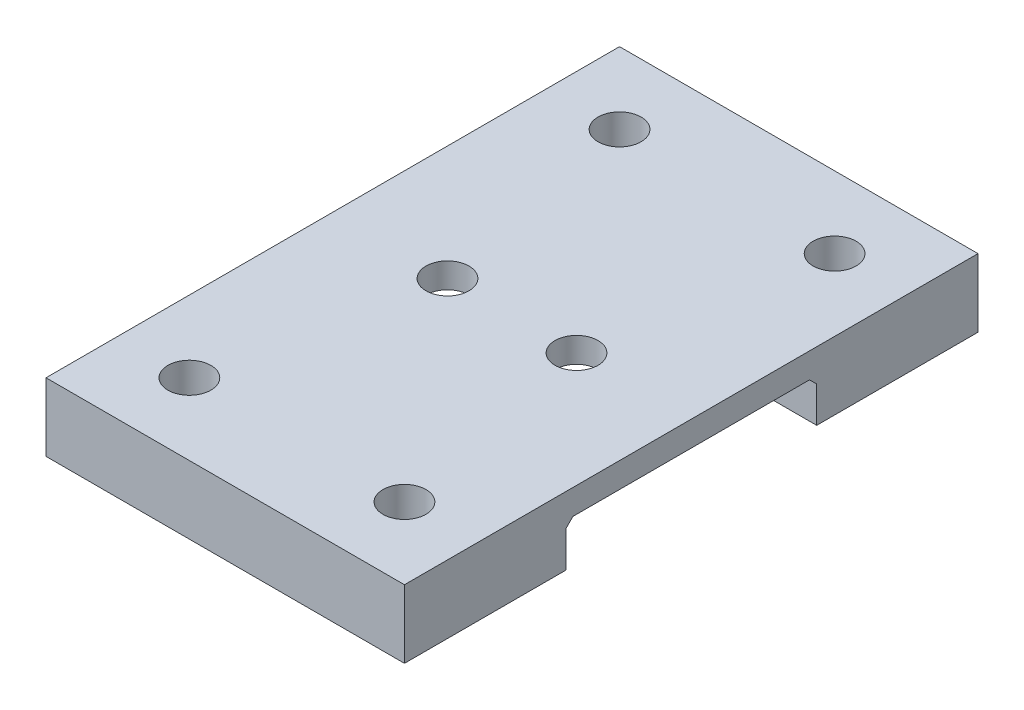
ISO-10303-21;
HEADER;
FILE_DESCRIPTION(('STEP AP214'),'2;1');
FILE_NAME('part.step','',(''),(''),'','','');
FILE_SCHEMA(('AUTOMOTIVE_DESIGN { 1 0 10303 214 1 1 1 1 }'));
ENDSEC;
DATA;
#1=APPLICATION_CONTEXT('core data for automotive mechanical design processes');
#2=APPLICATION_PROTOCOL_DEFINITION('international standard','automotive_design',2000,#1);
#3=PRODUCT_CONTEXT('',#1,'mechanical');
#4=PRODUCT('Part','Part','',(#3));
#5=PRODUCT_RELATED_PRODUCT_CATEGORY('part','',(#4));
#6=PRODUCT_DEFINITION_FORMATION('','',#4);
#7=PRODUCT_DEFINITION_CONTEXT('part definition',#1,'design');
#8=PRODUCT_DEFINITION('design','',#6,#7);
#9=PRODUCT_DEFINITION_SHAPE('','',#8);
#10=(LENGTH_UNIT() NAMED_UNIT(*) SI_UNIT(.MILLI.,.METRE.));
#11=(NAMED_UNIT(*) PLANE_ANGLE_UNIT() SI_UNIT($,.RADIAN.));
#12=(NAMED_UNIT(*) SI_UNIT($,.STERADIAN.) SOLID_ANGLE_UNIT());
#13=UNCERTAINTY_MEASURE_WITH_UNIT(LENGTH_MEASURE(1.E-05),#10,'distance_accuracy_value','');
#14=(GEOMETRIC_REPRESENTATION_CONTEXT(3) GLOBAL_UNCERTAINTY_ASSIGNED_CONTEXT((#13)) GLOBAL_UNIT_ASSIGNED_CONTEXT((#10,
#11,#12)) REPRESENTATION_CONTEXT('',''));
#15=CARTESIAN_POINT('',(0.,0.,0.));
#16=DIRECTION('',(0.,0.,1.));
#17=DIRECTION('',(1.,0.,0.));
#18=AXIS2_PLACEMENT_3D('',#15,#16,#17);
#19=CARTESIAN_POINT('',(0.,0.,0.));
#20=DIRECTION('',(0.,-1.,0.));
#21=DIRECTION('',(0.,0.,-1.));
#22=AXIS2_PLACEMENT_3D('',#19,#20,#21);
#23=PLANE('',#22);
#24=DIRECTION('',(1.,0.,0.));
#25=VECTOR('',#24,1.);
#26=CARTESIAN_POINT('',(-40.05051095991,0.,-17.5));
#27=LINE('',#26,#25);
#28=CARTESIAN_POINT('',(-25.,0.,-17.5));
#29=VERTEX_POINT('',#28);
#30=CARTESIAN_POINT('',(25.,0.,-17.5));
#31=VERTEX_POINT('',#30);
#32=EDGE_CURVE('E124',#29,#31,#27,.T.);
#33=ORIENTED_EDGE('',*,*,#32,.F.);
#34=DIRECTION('',(0.,0.,1.));
#35=VECTOR('',#34,1.);
#36=CARTESIAN_POINT('',(-25.,0.,40.));
#37=LINE('',#36,#35);
#38=CARTESIAN_POINT('',(-25.,0.,-40.));
#39=VERTEX_POINT('',#38);
#40=EDGE_CURVE('E141',#39,#29,#37,.T.);
#41=ORIENTED_EDGE('',*,*,#40,.F.);
#42=DIRECTION('',(-1.,0.,0.));
#43=VECTOR('',#42,1.);
#44=CARTESIAN_POINT('',(-25.,0.,-40.));
#45=LINE('',#44,#43);
#46=CARTESIAN_POINT('',(25.,0.,-40.));
#47=VERTEX_POINT('',#46);
#48=EDGE_CURVE('E132',#47,#39,#45,.T.);
#49=ORIENTED_EDGE('',*,*,#48,.F.);
#50=DIRECTION('',(0.,0.,-1.));
#51=VECTOR('',#50,1.);
#52=CARTESIAN_POINT('',(25.,0.,40.));
#53=LINE('',#52,#51);
#54=EDGE_CURVE('E133',#31,#47,#53,.T.);
#55=ORIENTED_EDGE('',*,*,#54,.F.);
#56=EDGE_LOOP('',(#33,#41,#49,#55));
#57=FACE_BOUND('',#56,.T.);
#58=CARTESIAN_POINT('',(15.,0.,-30.));
#59=DIRECTION('',(0.,1.,0.));
#60=DIRECTION('',(0.,0.,-1.));
#61=AXIS2_PLACEMENT_3D('',#58,#59,#60);
#62=CIRCLE('',#61,3.00000000000001);
#63=CARTESIAN_POINT('',(15.,0.,-33.));
#64=VERTEX_POINT('',#63);
#65=EDGE_CURVE('E207',#64,#64,#62,.T.);
#66=ORIENTED_EDGE('',*,*,#65,.T.);
#67=EDGE_LOOP('',(#66));
#68=FACE_BOUND('',#67,.T.);
#69=CARTESIAN_POINT('',(-15.,0.,-30.));
#70=DIRECTION('',(0.,1.,0.));
#71=DIRECTION('',(0.,0.,1.));
#72=AXIS2_PLACEMENT_3D('',#69,#70,#71);
#73=CIRCLE('',#72,3.);
#74=CARTESIAN_POINT('',(-15.,0.,-27.));
#75=VERTEX_POINT('',#74);
#76=EDGE_CURVE('E213',#75,#75,#73,.T.);
#77=ORIENTED_EDGE('',*,*,#76,.T.);
#78=EDGE_LOOP('',(#77));
#79=FACE_BOUND('',#78,.T.);
#80=ADVANCED_FACE('F33',(#57,#68,#79),#23,.T.);
#81=CARTESIAN_POINT('',(0.,9.5,0.));
#82=DIRECTION('',(0.,-1.,0.));
#83=DIRECTION('',(0.,0.,-1.));
#84=AXIS2_PLACEMENT_3D('',#81,#82,#83);
#85=PLANE('',#84);
#86=CARTESIAN_POINT('',(-9.,9.5,0.));
#87=DIRECTION('',(0.,-1.,0.));
#88=DIRECTION('',(0.,0.,-1.));
#89=AXIS2_PLACEMENT_3D('',#86,#87,#88);
#90=CIRCLE('',#89,3.0000000000005);
#91=CARTESIAN_POINT('',(-9.,9.5,-3.0000000000005));
#92=VERTEX_POINT('',#91);
#93=EDGE_CURVE('E125',#92,#92,#90,.T.);
#94=ORIENTED_EDGE('',*,*,#93,.T.);
#95=EDGE_LOOP('',(#94));
#96=FACE_BOUND('',#95,.T.);
#97=CARTESIAN_POINT('',(9.00000000000076,9.5,-3.85108611666851E-13));
#98=DIRECTION('',(0.,-1.,0.));
#99=DIRECTION('',(0.,0.,-1.));
#100=AXIS2_PLACEMENT_3D('',#97,#98,#99);
#101=CIRCLE('',#100,3.0000000000005);
#102=CARTESIAN_POINT('',(9.00000000000076,9.5,-3.00000000000088));
#103=VERTEX_POINT('',#102);
#104=EDGE_CURVE('E244',#103,#103,#101,.T.);
#105=ORIENTED_EDGE('',*,*,#104,.T.);
#106=EDGE_LOOP('',(#105));
#107=FACE_BOUND('',#106,.T.);
#108=DIRECTION('',(0.,0.,-1.));
#109=VECTOR('',#108,1.);
#110=CARTESIAN_POINT('',(25.,9.5,40.));
#111=LINE('',#110,#109);
#112=CARTESIAN_POINT('',(25.,9.5,40.));
#113=VERTEX_POINT('',#112);
#114=CARTESIAN_POINT('',(25.,9.5,-40.));
#115=VERTEX_POINT('',#114);
#116=EDGE_CURVE('E146',#113,#115,#111,.T.);
#117=ORIENTED_EDGE('',*,*,#116,.T.);
#118=DIRECTION('',(-1.,0.,0.));
#119=VECTOR('',#118,1.);
#120=CARTESIAN_POINT('',(-25.,9.5,-40.));
#121=LINE('',#120,#119);
#122=CARTESIAN_POINT('',(-25.,9.5,-40.));
#123=VERTEX_POINT('',#122);
#124=EDGE_CURVE('E222',#115,#123,#121,.T.);
#125=ORIENTED_EDGE('',*,*,#124,.T.);
#126=DIRECTION('',(0.,0.,1.));
#127=VECTOR('',#126,1.);
#128=CARTESIAN_POINT('',(-25.,9.5,40.));
#129=LINE('',#128,#127);
#130=CARTESIAN_POINT('',(-25.,9.5,40.));
#131=VERTEX_POINT('',#130);
#132=EDGE_CURVE('E223',#123,#131,#129,.T.);
#133=ORIENTED_EDGE('',*,*,#132,.T.);
#134=DIRECTION('',(1.,0.,0.));
#135=VECTOR('',#134,1.);
#136=CARTESIAN_POINT('',(-25.,9.5,40.));
#137=LINE('',#136,#135);
#138=EDGE_CURVE('E138',#131,#113,#137,.T.);
#139=ORIENTED_EDGE('',*,*,#138,.T.);
#140=EDGE_LOOP('',(#117,#125,#133,#139));
#141=FACE_BOUND('',#140,.T.);
#142=CARTESIAN_POINT('',(-15.,9.5,-30.));
#143=DIRECTION('',(0.,1.,0.));
#144=DIRECTION('',(0.,0.,1.));
#145=AXIS2_PLACEMENT_3D('',#142,#143,#144);
#146=CIRCLE('',#145,3.);
#147=CARTESIAN_POINT('',(-15.,9.5,-27.));
#148=VERTEX_POINT('',#147);
#149=EDGE_CURVE('E136',#148,#148,#146,.T.);
#150=ORIENTED_EDGE('',*,*,#149,.F.);
#151=EDGE_LOOP('',(#150));
#152=FACE_BOUND('',#151,.T.);
#153=CARTESIAN_POINT('',(15.,9.5,-30.));
#154=DIRECTION('',(0.,1.,0.));
#155=DIRECTION('',(0.,0.,-1.));
#156=AXIS2_PLACEMENT_3D('',#153,#154,#155);
#157=CIRCLE('',#156,3.00000000000001);
#158=CARTESIAN_POINT('',(15.,9.5,-33.));
#159=VERTEX_POINT('',#158);
#160=EDGE_CURVE('E210',#159,#159,#157,.T.);
#161=ORIENTED_EDGE('',*,*,#160,.F.);
#162=EDGE_LOOP('',(#161));
#163=FACE_BOUND('',#162,.T.);
#164=CARTESIAN_POINT('',(-15.,9.5,30.));
#165=DIRECTION('',(0.,1.,0.));
#166=DIRECTION('',(0.,0.,-1.));
#167=AXIS2_PLACEMENT_3D('',#164,#165,#166);
#168=CIRCLE('',#167,2.99999999999999);
#169=CARTESIAN_POINT('',(-15.,9.5,27.));
#170=VERTEX_POINT('',#169);
#171=EDGE_CURVE('E204',#170,#170,#168,.T.);
#172=ORIENTED_EDGE('',*,*,#171,.F.);
#173=EDGE_LOOP('',(#172));
#174=FACE_BOUND('',#173,.T.);
#175=CARTESIAN_POINT('',(15.,9.5,30.));
#176=DIRECTION('',(0.,1.,0.));
#177=DIRECTION('',(0.,0.,1.));
#178=AXIS2_PLACEMENT_3D('',#175,#176,#177);
#179=CIRCLE('',#178,3.);
#180=CARTESIAN_POINT('',(15.,9.5,33.));
#181=VERTEX_POINT('',#180);
#182=EDGE_CURVE('E197',#181,#181,#179,.T.);
#183=ORIENTED_EDGE('',*,*,#182,.F.);
#184=EDGE_LOOP('',(#183));
#185=FACE_BOUND('',#184,.T.);
#186=ADVANCED_FACE('F228',(#96,#107,#141,#152,#163,#174,#185),#85,.F.);
#187=DIRECTION('',(-1.,0.,0.));
#188=VECTOR('',#187,1.);
#189=CARTESIAN_POINT('',(-40.05051095991,0.,17.5));
#190=LINE('',#189,#188);
#191=CARTESIAN_POINT('',(25.,0.,17.5));
#192=VERTEX_POINT('',#191);
#193=CARTESIAN_POINT('',(-25.,0.,17.5));
#194=VERTEX_POINT('',#193);
#195=EDGE_CURVE('E109',#192,#194,#190,.T.);
#196=ORIENTED_EDGE('',*,*,#195,.F.);
#197=CARTESIAN_POINT('',(25.,0.,40.));
#198=VERTEX_POINT('',#197);
#199=EDGE_CURVE('E122',#198,#192,#53,.T.);
#200=ORIENTED_EDGE('',*,*,#199,.F.);
#201=DIRECTION('',(1.,0.,0.));
#202=VECTOR('',#201,1.);
#203=CARTESIAN_POINT('',(-25.,0.,40.));
#204=LINE('',#203,#202);
#205=CARTESIAN_POINT('',(-25.,0.,40.));
#206=VERTEX_POINT('',#205);
#207=EDGE_CURVE('E144',#206,#198,#204,.T.);
#208=ORIENTED_EDGE('',*,*,#207,.F.);
#209=EDGE_CURVE('E123',#194,#206,#37,.T.);
#210=ORIENTED_EDGE('',*,*,#209,.F.);
#211=EDGE_LOOP('',(#196,#200,#208,#210));
#212=FACE_BOUND('',#211,.T.);
#213=CARTESIAN_POINT('',(-15.,0.,30.));
#214=DIRECTION('',(0.,1.,0.));
#215=DIRECTION('',(0.,0.,-1.));
#216=AXIS2_PLACEMENT_3D('',#213,#214,#215);
#217=CIRCLE('',#216,2.99999999999999);
#218=CARTESIAN_POINT('',(-15.,0.,27.));
#219=VERTEX_POINT('',#218);
#220=EDGE_CURVE('E202',#219,#219,#217,.T.);
#221=ORIENTED_EDGE('',*,*,#220,.T.);
#222=EDGE_LOOP('',(#221));
#223=FACE_BOUND('',#222,.T.);
#224=CARTESIAN_POINT('',(15.,0.,30.));
#225=DIRECTION('',(0.,1.,0.));
#226=DIRECTION('',(0.,0.,1.));
#227=AXIS2_PLACEMENT_3D('',#224,#225,#226);
#228=CIRCLE('',#227,3.);
#229=CARTESIAN_POINT('',(15.,0.,33.));
#230=VERTEX_POINT('',#229);
#231=EDGE_CURVE('E194',#230,#230,#228,.T.);
#232=ORIENTED_EDGE('',*,*,#231,.T.);
#233=EDGE_LOOP('',(#232));
#234=FACE_BOUND('',#233,.T.);
#235=ADVANCED_FACE('F119',(#212,#223,#234),#23,.T.);
#236=CARTESIAN_POINT('',(25.,9.5,40.));
#237=DIRECTION('',(-1.,0.,0.));
#238=DIRECTION('',(0.,0.,1.));
#239=AXIS2_PLACEMENT_3D('',#236,#237,#238);
#240=PLANE('',#239);
#241=DIRECTION('',(0.,1.,0.));
#242=VECTOR('',#241,1.);
#243=CARTESIAN_POINT('',(25.,9.5,17.5));
#244=LINE('',#243,#242);
#245=CARTESIAN_POINT('',(25.,5.,17.5));
#246=VERTEX_POINT('',#245);
#247=EDGE_CURVE('E106',#192,#246,#244,.T.);
#248=ORIENTED_EDGE('',*,*,#247,.T.);
#249=DIRECTION('',(0.,-0.707106781186543,0.707106781186552));
#250=VECTOR('',#249,1.);
#251=CARTESIAN_POINT('',(25.,-4.00000000000004,26.5000000000002));
#252=LINE('',#251,#250);
#253=CARTESIAN_POINT('',(25.,6.,16.5));
#254=VERTEX_POINT('',#253);
#255=EDGE_CURVE('E11',#246,#254,#252,.F.);
#256=ORIENTED_EDGE('',*,*,#255,.T.);
#257=DIRECTION('',(0.,0.,-1.));
#258=VECTOR('',#257,1.);
#259=CARTESIAN_POINT('',(25.,6.,40.));
#260=LINE('',#259,#258);
#261=CARTESIAN_POINT('',(25.,6.,-16.5));
#262=VERTEX_POINT('',#261);
#263=EDGE_CURVE('E115',#254,#262,#260,.T.);
#264=ORIENTED_EDGE('',*,*,#263,.T.);
#265=DIRECTION('',(0.,0.707106781186543,0.707106781186552));
#266=VECTOR('',#265,1.);
#267=CARTESIAN_POINT('',(25.,36.,13.5000000000004));
#268=LINE('',#267,#266);
#269=CARTESIAN_POINT('',(25.,5.,-17.5));
#270=VERTEX_POINT('',#269);
#271=EDGE_CURVE('E173',#262,#270,#268,.F.);
#272=ORIENTED_EDGE('',*,*,#271,.T.);
#273=DIRECTION('',(0.,-1.,0.));
#274=VECTOR('',#273,1.);
#275=CARTESIAN_POINT('',(25.,9.5,-17.5));
#276=LINE('',#275,#274);
#277=EDGE_CURVE('E114',#270,#31,#276,.T.);
#278=ORIENTED_EDGE('',*,*,#277,.T.);
#279=ORIENTED_EDGE('',*,*,#54,.T.);
#280=DIRECTION('',(0.,-1.,0.));
#281=VECTOR('',#280,1.);
#282=CARTESIAN_POINT('',(25.,9.5,-40.));
#283=LINE('',#282,#281);
#284=EDGE_CURVE('E154',#115,#47,#283,.T.);
#285=ORIENTED_EDGE('',*,*,#284,.F.);
#286=ORIENTED_EDGE('',*,*,#116,.F.);
#287=DIRECTION('',(0.,-1.,0.));
#288=VECTOR('',#287,1.);
#289=CARTESIAN_POINT('',(25.,9.5,40.));
#290=LINE('',#289,#288);
#291=EDGE_CURVE('E131',#113,#198,#290,.T.);
#292=ORIENTED_EDGE('',*,*,#291,.T.);
#293=ORIENTED_EDGE('',*,*,#199,.T.);
#294=EDGE_LOOP('',(#248,#256,#264,#272,#278,#279,#285,#286,#292,#293));
#295=FACE_BOUND('',#294,.T.);
#296=ADVANCED_FACE('F128',(#295),#240,.F.);
#297=CARTESIAN_POINT('',(-25.,9.5,-40.));
#298=DIRECTION('',(0.,0.,1.));
#299=DIRECTION('',(1.,0.,0.));
#300=AXIS2_PLACEMENT_3D('',#297,#298,#299);
#301=PLANE('',#300);
#302=ORIENTED_EDGE('',*,*,#48,.T.);
#303=DIRECTION('',(0.,-1.,0.));
#304=VECTOR('',#303,1.);
#305=CARTESIAN_POINT('',(-25.,9.5,-40.));
#306=LINE('',#305,#304);
#307=EDGE_CURVE('E151',#123,#39,#306,.T.);
#308=ORIENTED_EDGE('',*,*,#307,.F.);
#309=ORIENTED_EDGE('',*,*,#124,.F.);
#310=ORIENTED_EDGE('',*,*,#284,.T.);
#311=EDGE_LOOP('',(#302,#308,#309,#310));
#312=FACE_BOUND('',#311,.T.);
#313=ADVANCED_FACE('F235',(#312),#301,.F.);
#314=CARTESIAN_POINT('',(-25.,9.5,40.));
#315=DIRECTION('',(1.,0.,0.));
#316=DIRECTION('',(0.,0.,-1.));
#317=AXIS2_PLACEMENT_3D('',#314,#315,#316);
#318=PLANE('',#317);
#319=ORIENTED_EDGE('',*,*,#40,.T.);
#320=DIRECTION('',(0.,1.,0.));
#321=VECTOR('',#320,1.);
#322=CARTESIAN_POINT('',(-25.,9.5,-17.5));
#323=LINE('',#322,#321);
#324=CARTESIAN_POINT('',(-25.,5.,-17.5));
#325=VERTEX_POINT('',#324);
#326=EDGE_CURVE('E161',#29,#325,#323,.T.);
#327=ORIENTED_EDGE('',*,*,#326,.T.);
#328=DIRECTION('',(0.,-0.707106781186543,-0.707106781186552));
#329=VECTOR('',#328,1.);
#330=CARTESIAN_POINT('',(-25.,36.,13.5000000000004));
#331=LINE('',#330,#329);
#332=CARTESIAN_POINT('',(-25.,6.,-16.5));
#333=VERTEX_POINT('',#332);
#334=EDGE_CURVE('E175',#325,#333,#331,.F.);
#335=ORIENTED_EDGE('',*,*,#334,.T.);
#336=DIRECTION('',(0.,0.,1.));
#337=VECTOR('',#336,1.);
#338=CARTESIAN_POINT('',(-25.,6.,40.));
#339=LINE('',#338,#337);
#340=CARTESIAN_POINT('',(-25.,6.,16.5));
#341=VERTEX_POINT('',#340);
#342=EDGE_CURVE('E157',#333,#341,#339,.T.);
#343=ORIENTED_EDGE('',*,*,#342,.T.);
#344=DIRECTION('',(0.,0.707106781186543,-0.707106781186552));
#345=VECTOR('',#344,1.);
#346=CARTESIAN_POINT('',(-25.,-4.00000000000004,26.5000000000002));
#347=LINE('',#346,#345);
#348=CARTESIAN_POINT('',(-25.,5.,17.5));
#349=VERTEX_POINT('',#348);
#350=EDGE_CURVE('E41',#341,#349,#347,.F.);
#351=ORIENTED_EDGE('',*,*,#350,.T.);
#352=DIRECTION('',(0.,-1.,0.));
#353=VECTOR('',#352,1.);
#354=CARTESIAN_POINT('',(-25.,9.5,17.5));
#355=LINE('',#354,#353);
#356=EDGE_CURVE('E159',#349,#194,#355,.T.);
#357=ORIENTED_EDGE('',*,*,#356,.T.);
#358=ORIENTED_EDGE('',*,*,#209,.T.);
#359=DIRECTION('',(0.,-1.,0.));
#360=VECTOR('',#359,1.);
#361=CARTESIAN_POINT('',(-25.,9.5,40.));
#362=LINE('',#361,#360);
#363=EDGE_CURVE('E148',#131,#206,#362,.T.);
#364=ORIENTED_EDGE('',*,*,#363,.F.);
#365=ORIENTED_EDGE('',*,*,#132,.F.);
#366=ORIENTED_EDGE('',*,*,#307,.T.);
#367=EDGE_LOOP('',(#319,#327,#335,#343,#351,#357,#358,#364,#365,#366));
#368=FACE_BOUND('',#367,.T.);
#369=ADVANCED_FACE('F178',(#368),#318,.F.);
#370=CARTESIAN_POINT('',(-25.,9.5,40.));
#371=DIRECTION('',(0.,0.,-1.));
#372=DIRECTION('',(-1.,0.,0.));
#373=AXIS2_PLACEMENT_3D('',#370,#371,#372);
#374=PLANE('',#373);
#375=ORIENTED_EDGE('',*,*,#207,.T.);
#376=ORIENTED_EDGE('',*,*,#291,.F.);
#377=ORIENTED_EDGE('',*,*,#138,.F.);
#378=ORIENTED_EDGE('',*,*,#363,.T.);
#379=EDGE_LOOP('',(#375,#376,#377,#378));
#380=FACE_BOUND('',#379,.T.);
#381=ADVANCED_FACE('F232',(#380),#374,.F.);
#382=CARTESIAN_POINT('',(-15.,9.5,-30.));
#383=DIRECTION('',(0.,-1.,0.));
#384=DIRECTION('',(0.,0.,-1.));
#385=AXIS2_PLACEMENT_3D('',#382,#383,#384);
#386=CYLINDRICAL_SURFACE('',#385,3.);
#387=ORIENTED_EDGE('',*,*,#149,.T.);
#388=EDGE_LOOP('',(#387));
#389=FACE_BOUND('',#388,.T.);
#390=ORIENTED_EDGE('',*,*,#76,.F.);
#391=EDGE_LOOP('',(#390));
#392=FACE_BOUND('',#391,.T.);
#393=ADVANCED_FACE('F392',(#389,#392),#386,.F.);
#394=CARTESIAN_POINT('',(15.,9.5,-30.));
#395=DIRECTION('',(0.,-1.,0.));
#396=DIRECTION('',(0.,0.,-1.));
#397=AXIS2_PLACEMENT_3D('',#394,#395,#396);
#398=CYLINDRICAL_SURFACE('',#397,3.00000000000001);
#399=ORIENTED_EDGE('',*,*,#160,.T.);
#400=EDGE_LOOP('',(#399));
#401=FACE_BOUND('',#400,.T.);
#402=ORIENTED_EDGE('',*,*,#65,.F.);
#403=EDGE_LOOP('',(#402));
#404=FACE_BOUND('',#403,.T.);
#405=ADVANCED_FACE('F382',(#401,#404),#398,.F.);
#406=CARTESIAN_POINT('',(-15.,9.5,30.));
#407=DIRECTION('',(0.,-1.,0.));
#408=DIRECTION('',(0.,0.,-1.));
#409=AXIS2_PLACEMENT_3D('',#406,#407,#408);
#410=CYLINDRICAL_SURFACE('',#409,2.99999999999999);
#411=ORIENTED_EDGE('',*,*,#171,.T.);
#412=EDGE_LOOP('',(#411));
#413=FACE_BOUND('',#412,.T.);
#414=ORIENTED_EDGE('',*,*,#220,.F.);
#415=EDGE_LOOP('',(#414));
#416=FACE_BOUND('',#415,.T.);
#417=ADVANCED_FACE('F372',(#413,#416),#410,.F.);
#418=CARTESIAN_POINT('',(15.,9.5,30.));
#419=DIRECTION('',(0.,-1.,0.));
#420=DIRECTION('',(0.,0.,-1.));
#421=AXIS2_PLACEMENT_3D('',#418,#419,#420);
#422=CYLINDRICAL_SURFACE('',#421,3.);
#423=ORIENTED_EDGE('',*,*,#182,.T.);
#424=EDGE_LOOP('',(#423));
#425=FACE_BOUND('',#424,.T.);
#426=ORIENTED_EDGE('',*,*,#231,.F.);
#427=EDGE_LOOP('',(#426));
#428=FACE_BOUND('',#427,.T.);
#429=ADVANCED_FACE('F327',(#425,#428),#422,.F.);
#430=CARTESIAN_POINT('',(-40.05051095991,6.,-17.5));
#431=DIRECTION('',(0.,0.,-1.));
#432=DIRECTION('',(-1.,0.,0.));
#433=AXIS2_PLACEMENT_3D('',#430,#431,#432);
#434=PLANE('',#433);
#435=ORIENTED_EDGE('',*,*,#277,.F.);
#436=DIRECTION('',(-1.,0.,0.));
#437=VECTOR('',#436,1.);
#438=CARTESIAN_POINT('',(-25.,5.,-17.5));
#439=LINE('',#438,#437);
#440=EDGE_CURVE('E170',#270,#325,#439,.T.);
#441=ORIENTED_EDGE('',*,*,#440,.T.);
#442=ORIENTED_EDGE('',*,*,#326,.F.);
#443=ORIENTED_EDGE('',*,*,#32,.T.);
#444=EDGE_LOOP('',(#435,#441,#442,#443));
#445=FACE_BOUND('',#444,.T.);
#446=ADVANCED_FACE('F191',(#445),#434,.F.);
#447=CARTESIAN_POINT('',(-40.05051095991,6.,17.5));
#448=DIRECTION('',(0.,0.,1.));
#449=DIRECTION('',(1.,0.,0.));
#450=AXIS2_PLACEMENT_3D('',#447,#448,#449);
#451=PLANE('',#450);
#452=ORIENTED_EDGE('',*,*,#356,.F.);
#453=DIRECTION('',(1.,0.,0.));
#454=VECTOR('',#453,1.);
#455=CARTESIAN_POINT('',(25.,5.,17.5));
#456=LINE('',#455,#454);
#457=EDGE_CURVE('E48',#349,#246,#456,.T.);
#458=ORIENTED_EDGE('',*,*,#457,.T.);
#459=ORIENTED_EDGE('',*,*,#247,.F.);
#460=ORIENTED_EDGE('',*,*,#195,.T.);
#461=EDGE_LOOP('',(#452,#458,#459,#460));
#462=FACE_BOUND('',#461,.T.);
#463=ADVANCED_FACE('F108',(#462),#451,.F.);
#464=CARTESIAN_POINT('',(0.,6.,0.));
#465=DIRECTION('',(0.,1.,0.));
#466=DIRECTION('',(0.,0.,1.));
#467=AXIS2_PLACEMENT_3D('',#464,#465,#466);
#468=PLANE('',#467);
#469=CARTESIAN_POINT('',(-9.,6.,0.));
#470=DIRECTION('',(0.,-1.,0.));
#471=DIRECTION('',(0.,0.,-1.));
#472=AXIS2_PLACEMENT_3D('',#469,#470,#471);
#473=CIRCLE('',#472,3.0000000000005);
#474=CARTESIAN_POINT('',(-9.,6.,-3.0000000000005));
#475=VERTEX_POINT('',#474);
#476=EDGE_CURVE('E247',#475,#475,#473,.T.);
#477=ORIENTED_EDGE('',*,*,#476,.F.);
#478=EDGE_LOOP('',(#477));
#479=FACE_BOUND('',#478,.T.);
#480=CARTESIAN_POINT('',(9.00000000000076,6.,-3.85108611666851E-13));
#481=DIRECTION('',(0.,-1.,0.));
#482=DIRECTION('',(0.,0.,-1.));
#483=AXIS2_PLACEMENT_3D('',#480,#481,#482);
#484=CIRCLE('',#483,3.0000000000005);
#485=CARTESIAN_POINT('',(9.00000000000076,6.,-3.00000000000088));
#486=VERTEX_POINT('',#485);
#487=EDGE_CURVE('E241',#486,#486,#484,.T.);
#488=ORIENTED_EDGE('',*,*,#487,.F.);
#489=EDGE_LOOP('',(#488));
#490=FACE_BOUND('',#489,.T.);
#491=ORIENTED_EDGE('',*,*,#342,.F.);
#492=DIRECTION('',(1.,0.,0.));
#493=VECTOR('',#492,1.);
#494=CARTESIAN_POINT('',(25.,6.,-16.5));
#495=LINE('',#494,#493);
#496=EDGE_CURVE('E167',#333,#262,#495,.T.);
#497=ORIENTED_EDGE('',*,*,#496,.T.);
#498=ORIENTED_EDGE('',*,*,#263,.F.);
#499=DIRECTION('',(-1.,0.,0.));
#500=VECTOR('',#499,1.);
#501=CARTESIAN_POINT('',(-25.,6.,16.5));
#502=LINE('',#501,#500);
#503=EDGE_CURVE('E164',#254,#341,#502,.T.);
#504=ORIENTED_EDGE('',*,*,#503,.T.);
#505=EDGE_LOOP('',(#491,#497,#498,#504));
#506=FACE_BOUND('',#505,.T.);
#507=ADVANCED_FACE('F183',(#479,#490,#506),#468,.F.);
#508=CARTESIAN_POINT('',(9.00000000000076,9.5,-3.85108611666851E-13));
#509=DIRECTION('',(0.,-1.,0.));
#510=DIRECTION('',(0.,0.,-1.));
#511=AXIS2_PLACEMENT_3D('',#508,#509,#510);
#512=CYLINDRICAL_SURFACE('',#511,3.0000000000005);
#513=CARTESIAN_POINT('',(9.00000000000076,9.5,-3.00000000000088));
#514=CARTESIAN_POINT('',(9.00000000000076,9.46354166666667,-3.00000000000088));
#515=CARTESIAN_POINT('',(9.00000000000076,9.42708333333333,-3.00000000000088));
#516=CARTESIAN_POINT('',(9.00000000000076,9.35416666666667,-3.00000000000088));
#517=CARTESIAN_POINT('',(9.00000000000076,9.31770833333333,-3.00000000000088));
#518=CARTESIAN_POINT('',(9.00000000000076,9.24479166666667,-3.00000000000088));
#519=CARTESIAN_POINT('',(9.00000000000076,9.20833333333333,-3.00000000000088));
#520=CARTESIAN_POINT('',(9.00000000000076,9.13541666666667,-3.00000000000088));
#521=CARTESIAN_POINT('',(9.00000000000076,9.09895833333333,-3.00000000000088));
#522=CARTESIAN_POINT('',(9.00000000000076,9.02604166666667,-3.00000000000088));
#523=CARTESIAN_POINT('',(9.00000000000076,8.98958333333333,-3.00000000000088));
#524=CARTESIAN_POINT('',(9.00000000000076,8.91666666666667,-3.00000000000088));
#525=CARTESIAN_POINT('',(9.00000000000076,8.88020833333333,-3.00000000000088));
#526=CARTESIAN_POINT('',(9.00000000000076,8.80729166666667,-3.00000000000088));
#527=CARTESIAN_POINT('',(9.00000000000076,8.77083333333333,-3.00000000000088));
#528=CARTESIAN_POINT('',(9.00000000000076,8.69791666666667,-3.00000000000088));
#529=CARTESIAN_POINT('',(9.00000000000076,8.66145833333333,-3.00000000000088));
#530=CARTESIAN_POINT('',(9.00000000000076,8.58854166666667,-3.00000000000088));
#531=CARTESIAN_POINT('',(9.00000000000076,8.55208333333333,-3.00000000000088));
#532=CARTESIAN_POINT('',(9.00000000000076,8.47916666666667,-3.00000000000088));
#533=CARTESIAN_POINT('',(9.00000000000076,8.44270833333333,-3.00000000000088));
#534=CARTESIAN_POINT('',(9.00000000000076,8.36979166666667,-3.00000000000088));
#535=CARTESIAN_POINT('',(9.00000000000076,8.33333333333333,-3.00000000000088));
#536=CARTESIAN_POINT('',(9.00000000000076,8.26041666666667,-3.00000000000088));
#537=CARTESIAN_POINT('',(9.00000000000076,8.22395833333333,-3.00000000000088));
#538=CARTESIAN_POINT('',(9.00000000000076,8.15104166666667,-3.00000000000088));
#539=CARTESIAN_POINT('',(9.00000000000076,8.11458333333333,-3.00000000000088));
#540=CARTESIAN_POINT('',(9.00000000000076,8.04166666666667,-3.00000000000088));
#541=CARTESIAN_POINT('',(9.00000000000076,8.00520833333333,-3.00000000000088));
#542=CARTESIAN_POINT('',(9.00000000000076,7.93229166666667,-3.00000000000088));
#543=CARTESIAN_POINT('',(9.00000000000076,7.89583333333333,-3.00000000000088));
#544=CARTESIAN_POINT('',(9.00000000000076,7.82291666666667,-3.00000000000088));
#545=CARTESIAN_POINT('',(9.00000000000076,7.78645833333333,-3.00000000000088));
#546=CARTESIAN_POINT('',(9.00000000000076,7.71354166666667,-3.00000000000088));
#547=CARTESIAN_POINT('',(9.00000000000076,7.67708333333333,-3.00000000000088));
#548=CARTESIAN_POINT('',(9.00000000000076,7.60416666666667,-3.00000000000088));
#549=CARTESIAN_POINT('',(9.00000000000076,7.56770833333333,-3.00000000000088));
#550=CARTESIAN_POINT('',(9.00000000000076,7.49479166666667,-3.00000000000088));
#551=CARTESIAN_POINT('',(9.00000000000076,7.45833333333333,-3.00000000000088));
#552=CARTESIAN_POINT('',(9.00000000000076,7.38541666666667,-3.00000000000088));
#553=CARTESIAN_POINT('',(9.00000000000076,7.34895833333333,-3.00000000000088));
#554=CARTESIAN_POINT('',(9.00000000000076,7.27604166666667,-3.00000000000088));
#555=CARTESIAN_POINT('',(9.00000000000076,7.23958333333333,-3.00000000000088));
#556=CARTESIAN_POINT('',(9.00000000000076,7.16666666666667,-3.00000000000088));
#557=CARTESIAN_POINT('',(9.00000000000076,7.13020833333333,-3.00000000000088));
#558=CARTESIAN_POINT('',(9.00000000000076,7.05729166666667,-3.00000000000088));
#559=CARTESIAN_POINT('',(9.00000000000076,7.02083333333333,-3.00000000000088));
#560=CARTESIAN_POINT('',(9.00000000000076,6.94791666666667,-3.00000000000088));
#561=CARTESIAN_POINT('',(9.00000000000076,6.91145833333333,-3.00000000000088));
#562=CARTESIAN_POINT('',(9.00000000000076,6.83854166666667,-3.00000000000088));
#563=CARTESIAN_POINT('',(9.00000000000076,6.80208333333333,-3.00000000000088));
#564=CARTESIAN_POINT('',(9.00000000000076,6.72916666666667,-3.00000000000088));
#565=CARTESIAN_POINT('',(9.00000000000076,6.69270833333333,-3.00000000000088));
#566=CARTESIAN_POINT('',(9.00000000000076,6.61979166666667,-3.00000000000088));
#567=CARTESIAN_POINT('',(9.00000000000076,6.58333333333333,-3.00000000000088));
#568=CARTESIAN_POINT('',(9.00000000000076,6.51041666666667,-3.00000000000088));
#569=CARTESIAN_POINT('',(9.00000000000076,6.47395833333333,-3.00000000000088));
#570=CARTESIAN_POINT('',(9.00000000000076,6.40104166666667,-3.00000000000088));
#571=CARTESIAN_POINT('',(9.00000000000076,6.36458333333333,-3.00000000000088));
#572=CARTESIAN_POINT('',(9.00000000000076,6.29166666666667,-3.00000000000088));
#573=CARTESIAN_POINT('',(9.00000000000076,6.25520833333333,-3.00000000000088));
#574=CARTESIAN_POINT('',(9.00000000000076,6.18229166666667,-3.00000000000088));
#575=CARTESIAN_POINT('',(9.00000000000076,6.14583333333333,-3.00000000000088));
#576=CARTESIAN_POINT('',(9.00000000000076,6.07291666666667,-3.00000000000088));
#577=CARTESIAN_POINT('',(9.00000000000076,6.03645833333333,-3.00000000000088));
#578=CARTESIAN_POINT('',(9.00000000000076,6.,-3.00000000000088));
#579=B_SPLINE_CURVE_WITH_KNOTS('',3,(#513,#514,#515,#516,#517,#518,#519,#520,#521,#522,#523,
#524,#525,#526,#527,#528,#529,#530,#531,#532,#533,#534,#535,#536,#537,#538,#539,#540,#541,#542,
#543,#544,#545,#546,#547,#548,#549,#550,#551,#552,#553,#554,#555,#556,#557,#558,#559,#560,#561,
#562,#563,#564,#565,#566,#567,#568,#569,#570,#571,#572,#573,#574,#575,#576,#577,#578),
.UNSPECIFIED.,.F.,.F.,(4,2,2,2,2,2,2,2,2,2,2,2,2,2,2,2,2,2,2,2,2,2,2,2,2,2,2,2,2,2,2,2,4),(0.,
0.109375,0.21875,0.328125,0.4375,0.546875,0.656250000000001,0.765625000000001,0.875000000000001,
0.984375000000001,1.09375,1.203125,1.3125,1.421875,1.53125,1.640625,1.75,1.859375,1.96875,
2.078125,2.1875,2.296875,2.40625,2.515625,2.625,2.734375,2.84375,2.953125,3.0625,3.171875,
3.28125,3.390625,3.5),.UNSPECIFIED.);
#580=EDGE_CURVE('BSEAM258',#103,#486,#579,.T.);
#581=ORIENTED_EDGE('',*,*,#104,.F.);
#582=ORIENTED_EDGE('',*,*,#487,.T.);
#583=ORIENTED_EDGE('',*,*,#580,.T.);
#584=ORIENTED_EDGE('',*,*,#580,.F.);
#585=EDGE_LOOP('',(#581,#583,#582,#584));
#586=FACE_BOUND('',#585,.T.);
#587=ADVANCED_FACE('F258',(#586),#512,.F.);
#588=CARTESIAN_POINT('',(-9.,9.5,0.));
#589=DIRECTION('',(0.,-1.,0.));
#590=DIRECTION('',(0.,0.,-1.));
#591=AXIS2_PLACEMENT_3D('',#588,#589,#590);
#592=CYLINDRICAL_SURFACE('',#591,3.0000000000005);
#593=CARTESIAN_POINT('',(-9.,9.5,-3.0000000000005));
#594=CARTESIAN_POINT('',(-9.,9.46354166666667,-3.0000000000005));
#595=CARTESIAN_POINT('',(-9.,9.42708333333333,-3.0000000000005));
#596=CARTESIAN_POINT('',(-9.,9.35416666666667,-3.0000000000005));
#597=CARTESIAN_POINT('',(-9.,9.31770833333333,-3.0000000000005));
#598=CARTESIAN_POINT('',(-9.,9.24479166666667,-3.0000000000005));
#599=CARTESIAN_POINT('',(-9.,9.20833333333333,-3.0000000000005));
#600=CARTESIAN_POINT('',(-9.,9.13541666666667,-3.0000000000005));
#601=CARTESIAN_POINT('',(-9.,9.09895833333333,-3.0000000000005));
#602=CARTESIAN_POINT('',(-9.,9.02604166666667,-3.0000000000005));
#603=CARTESIAN_POINT('',(-9.,8.98958333333333,-3.0000000000005));
#604=CARTESIAN_POINT('',(-9.,8.91666666666667,-3.0000000000005));
#605=CARTESIAN_POINT('',(-9.,8.88020833333333,-3.0000000000005));
#606=CARTESIAN_POINT('',(-9.,8.80729166666667,-3.0000000000005));
#607=CARTESIAN_POINT('',(-9.,8.77083333333333,-3.0000000000005));
#608=CARTESIAN_POINT('',(-9.,8.69791666666667,-3.0000000000005));
#609=CARTESIAN_POINT('',(-9.,8.66145833333333,-3.0000000000005));
#610=CARTESIAN_POINT('',(-9.,8.58854166666667,-3.0000000000005));
#611=CARTESIAN_POINT('',(-9.,8.55208333333333,-3.0000000000005));
#612=CARTESIAN_POINT('',(-9.,8.47916666666667,-3.0000000000005));
#613=CARTESIAN_POINT('',(-9.,8.44270833333333,-3.0000000000005));
#614=CARTESIAN_POINT('',(-9.,8.36979166666667,-3.0000000000005));
#615=CARTESIAN_POINT('',(-9.,8.33333333333333,-3.0000000000005));
#616=CARTESIAN_POINT('',(-9.,8.26041666666667,-3.0000000000005));
#617=CARTESIAN_POINT('',(-9.,8.22395833333333,-3.0000000000005));
#618=CARTESIAN_POINT('',(-9.,8.15104166666667,-3.0000000000005));
#619=CARTESIAN_POINT('',(-9.,8.11458333333333,-3.0000000000005));
#620=CARTESIAN_POINT('',(-9.,8.04166666666667,-3.0000000000005));
#621=CARTESIAN_POINT('',(-9.,8.00520833333333,-3.0000000000005));
#622=CARTESIAN_POINT('',(-9.,7.93229166666667,-3.0000000000005));
#623=CARTESIAN_POINT('',(-9.,7.89583333333333,-3.0000000000005));
#624=CARTESIAN_POINT('',(-9.,7.82291666666667,-3.0000000000005));
#625=CARTESIAN_POINT('',(-9.,7.78645833333333,-3.0000000000005));
#626=CARTESIAN_POINT('',(-9.,7.71354166666667,-3.0000000000005));
#627=CARTESIAN_POINT('',(-9.,7.67708333333333,-3.0000000000005));
#628=CARTESIAN_POINT('',(-9.,7.60416666666667,-3.0000000000005));
#629=CARTESIAN_POINT('',(-9.,7.56770833333333,-3.0000000000005));
#630=CARTESIAN_POINT('',(-9.,7.49479166666667,-3.0000000000005));
#631=CARTESIAN_POINT('',(-9.,7.45833333333333,-3.0000000000005));
#632=CARTESIAN_POINT('',(-9.,7.38541666666667,-3.0000000000005));
#633=CARTESIAN_POINT('',(-9.,7.34895833333333,-3.0000000000005));
#634=CARTESIAN_POINT('',(-9.,7.27604166666667,-3.0000000000005));
#635=CARTESIAN_POINT('',(-9.,7.23958333333333,-3.0000000000005));
#636=CARTESIAN_POINT('',(-9.,7.16666666666667,-3.0000000000005));
#637=CARTESIAN_POINT('',(-9.,7.13020833333333,-3.0000000000005));
#638=CARTESIAN_POINT('',(-9.,7.05729166666667,-3.0000000000005));
#639=CARTESIAN_POINT('',(-9.,7.02083333333333,-3.0000000000005));
#640=CARTESIAN_POINT('',(-9.,6.94791666666667,-3.0000000000005));
#641=CARTESIAN_POINT('',(-9.,6.91145833333333,-3.0000000000005));
#642=CARTESIAN_POINT('',(-9.,6.83854166666667,-3.0000000000005));
#643=CARTESIAN_POINT('',(-9.,6.80208333333333,-3.0000000000005));
#644=CARTESIAN_POINT('',(-9.,6.72916666666667,-3.0000000000005));
#645=CARTESIAN_POINT('',(-9.,6.69270833333333,-3.0000000000005));
#646=CARTESIAN_POINT('',(-9.,6.61979166666667,-3.0000000000005));
#647=CARTESIAN_POINT('',(-9.,6.58333333333333,-3.0000000000005));
#648=CARTESIAN_POINT('',(-9.,6.51041666666667,-3.0000000000005));
#649=CARTESIAN_POINT('',(-9.,6.47395833333333,-3.0000000000005));
#650=CARTESIAN_POINT('',(-9.,6.40104166666667,-3.0000000000005));
#651=CARTESIAN_POINT('',(-9.,6.36458333333333,-3.0000000000005));
#652=CARTESIAN_POINT('',(-9.,6.29166666666667,-3.0000000000005));
#653=CARTESIAN_POINT('',(-9.,6.25520833333333,-3.0000000000005));
#654=CARTESIAN_POINT('',(-9.,6.18229166666667,-3.0000000000005));
#655=CARTESIAN_POINT('',(-9.,6.14583333333333,-3.0000000000005));
#656=CARTESIAN_POINT('',(-9.,6.07291666666667,-3.0000000000005));
#657=CARTESIAN_POINT('',(-9.,6.03645833333333,-3.0000000000005));
#658=CARTESIAN_POINT('',(-9.,6.,-3.0000000000005));
#659=B_SPLINE_CURVE_WITH_KNOTS('',3,(#593,#594,#595,#596,#597,#598,#599,#600,#601,#602,#603,
#604,#605,#606,#607,#608,#609,#610,#611,#612,#613,#614,#615,#616,#617,#618,#619,#620,#621,#622,
#623,#624,#625,#626,#627,#628,#629,#630,#631,#632,#633,#634,#635,#636,#637,#638,#639,#640,#641,
#642,#643,#644,#645,#646,#647,#648,#649,#650,#651,#652,#653,#654,#655,#656,#657,#658),
.UNSPECIFIED.,.F.,.F.,(4,2,2,2,2,2,2,2,2,2,2,2,2,2,2,2,2,2,2,2,2,2,2,2,2,2,2,2,2,2,2,2,4),(0.,
0.109375,0.21875,0.328125,0.4375,0.546875,0.656250000000001,0.765625000000001,0.875000000000001,
0.984375000000001,1.09375,1.203125,1.3125,1.421875,1.53125,1.640625,1.75,1.859375,1.96875,
2.078125,2.1875,2.296875,2.40625,2.515625,2.625,2.734375,2.84375,2.953125,3.0625,3.171875,
3.28125,3.390625,3.5),.UNSPECIFIED.);
#660=EDGE_CURVE('BSEAM255',#92,#475,#659,.T.);
#661=ORIENTED_EDGE('',*,*,#93,.F.);
#662=ORIENTED_EDGE('',*,*,#476,.T.);
#663=ORIENTED_EDGE('',*,*,#660,.T.);
#664=ORIENTED_EDGE('',*,*,#660,.F.);
#665=EDGE_LOOP('',(#661,#663,#662,#664));
#666=FACE_BOUND('',#665,.T.);
#667=ADVANCED_FACE('F255',(#666),#592,.F.);
#668=CARTESIAN_POINT('',(0.,6.,-16.5));
#669=DIRECTION('',(0.,-0.707106781186552,0.707106781186542));
#670=DIRECTION('',(-1.,0.,0.));
#671=AXIS2_PLACEMENT_3D('',#668,#669,#670);
#672=PLANE('',#671);
#673=ORIENTED_EDGE('',*,*,#334,.F.);
#674=ORIENTED_EDGE('',*,*,#440,.F.);
#675=ORIENTED_EDGE('',*,*,#271,.F.);
#676=ORIENTED_EDGE('',*,*,#496,.F.);
#677=EDGE_LOOP('',(#673,#674,#675,#676));
#678=FACE_BOUND('',#677,.T.);
#679=ADVANCED_FACE('F187',(#678),#672,.T.);
#680=CARTESIAN_POINT('',(0.,6.,16.5));
#681=DIRECTION('',(0.,-0.707106781186552,-0.707106781186542));
#682=DIRECTION('',(1.,0.,0.));
#683=AXIS2_PLACEMENT_3D('',#680,#681,#682);
#684=PLANE('',#683);
#685=ORIENTED_EDGE('',*,*,#255,.F.);
#686=ORIENTED_EDGE('',*,*,#457,.F.);
#687=ORIENTED_EDGE('',*,*,#350,.F.);
#688=ORIENTED_EDGE('',*,*,#503,.F.);
#689=EDGE_LOOP('',(#685,#686,#687,#688));
#690=FACE_BOUND('',#689,.T.);
#691=ADVANCED_FACE('F35',(#690),#684,.T.);
#692=CLOSED_SHELL('',(#80,#186,#235,#296,#313,#369,#381,#393,#405,#417,#429,#446,#463,#507,#587,
#667,#679,#691));
#693=MANIFOLD_SOLID_BREP('B2',#692);
#694=ADVANCED_BREP_SHAPE_REPRESENTATION('',(#18,#693),#14);
#695=SHAPE_DEFINITION_REPRESENTATION(#9,#694);
ENDSEC;
END-ISO-10303-21;
